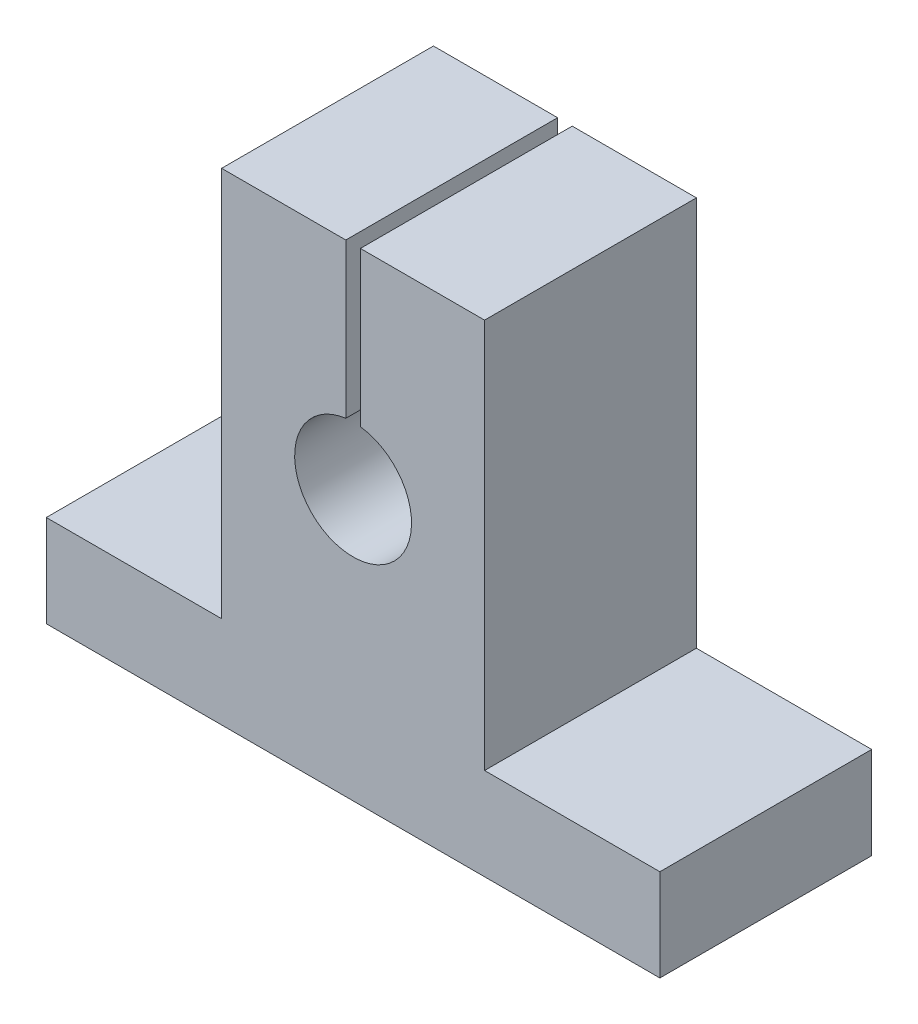
ISO-10303-21;
HEADER;
FILE_DESCRIPTION(('STEP AP214'),'2;1');
FILE_NAME('part.step','',(''),(''),'','','');
FILE_SCHEMA(('AUTOMOTIVE_DESIGN { 1 0 10303 214 1 1 1 1 }'));
ENDSEC;
DATA;
#1=APPLICATION_CONTEXT('core data for automotive mechanical design processes');
#2=APPLICATION_PROTOCOL_DEFINITION('international standard','automotive_design',2000,#1);
#3=PRODUCT_CONTEXT('',#1,'mechanical');
#4=PRODUCT('Part','Part','',(#3));
#5=PRODUCT_RELATED_PRODUCT_CATEGORY('part','',(#4));
#6=PRODUCT_DEFINITION_FORMATION('','',#4);
#7=PRODUCT_DEFINITION_CONTEXT('part definition',#1,'design');
#8=PRODUCT_DEFINITION('design','',#6,#7);
#9=PRODUCT_DEFINITION_SHAPE('','',#8);
#10=(LENGTH_UNIT() NAMED_UNIT(*) SI_UNIT(.MILLI.,.METRE.));
#11=(NAMED_UNIT(*) PLANE_ANGLE_UNIT() SI_UNIT($,.RADIAN.));
#12=(NAMED_UNIT(*) SI_UNIT($,.STERADIAN.) SOLID_ANGLE_UNIT());
#13=UNCERTAINTY_MEASURE_WITH_UNIT(LENGTH_MEASURE(1.E-05),#10,'distance_accuracy_value','');
#14=(GEOMETRIC_REPRESENTATION_CONTEXT(3) GLOBAL_UNCERTAINTY_ASSIGNED_CONTEXT((#13)) GLOBAL_UNIT_ASSIGNED_CONTEXT((#10,
#11,#12)) REPRESENTATION_CONTEXT('',''));
#15=CARTESIAN_POINT('',(0.,0.,0.));
#16=DIRECTION('',(0.,0.,1.));
#17=DIRECTION('',(1.,0.,0.));
#18=AXIS2_PLACEMENT_3D('',#15,#16,#17);
#19=CARTESIAN_POINT('',(21.,0.,14.5));
#20=DIRECTION('',(-1.,0.,0.));
#21=DIRECTION('',(0.,0.,1.));
#22=AXIS2_PLACEMENT_3D('',#19,#20,#21);
#23=PLANE('',#22);
#24=DIRECTION('',(0.,1.,0.));
#25=VECTOR('',#24,1.);
#26=CARTESIAN_POINT('',(21.,0.,0.));
#27=LINE('',#26,#25);
#28=CARTESIAN_POINT('',(21.,0.,0.));
#29=VERTEX_POINT('',#28);
#30=CARTESIAN_POINT('',(21.,6.30000000000001,0.));
#31=VERTEX_POINT('',#30);
#32=EDGE_CURVE('E153',#29,#31,#27,.T.);
#33=ORIENTED_EDGE('',*,*,#32,.T.);
#34=DIRECTION('',(0.,0.,-1.));
#35=VECTOR('',#34,1.);
#36=CARTESIAN_POINT('',(21.,6.30000000000001,14.5));
#37=LINE('',#36,#35);
#38=CARTESIAN_POINT('',(21.,6.30000000000001,14.5));
#39=VERTEX_POINT('',#38);
#40=EDGE_CURVE('E11',#39,#31,#37,.T.);
#41=ORIENTED_EDGE('',*,*,#40,.F.);
#42=DIRECTION('',(0.,1.,0.));
#43=VECTOR('',#42,1.);
#44=CARTESIAN_POINT('',(21.,0.,14.5));
#45=LINE('',#44,#43);
#46=CARTESIAN_POINT('',(21.,0.,14.5));
#47=VERTEX_POINT('',#46);
#48=EDGE_CURVE('E175',#47,#39,#45,.T.);
#49=ORIENTED_EDGE('',*,*,#48,.F.);
#50=DIRECTION('',(0.,0.,-1.));
#51=VECTOR('',#50,1.);
#52=CARTESIAN_POINT('',(21.,0.,14.5));
#53=LINE('',#52,#51);
#54=EDGE_CURVE('E149',#47,#29,#53,.T.);
#55=ORIENTED_EDGE('',*,*,#54,.T.);
#56=EDGE_LOOP('',(#33,#41,#49,#55));
#57=FACE_BOUND('',#56,.T.);
#58=ADVANCED_FACE('F33',(#57),#23,.F.);
#59=CARTESIAN_POINT('',(21.,6.30000000000001,14.5));
#60=DIRECTION('',(0.,-1.,0.));
#61=DIRECTION('',(1.,0.,0.));
#62=AXIS2_PLACEMENT_3D('',#59,#60,#61);
#63=PLANE('',#62);
#64=DIRECTION('',(-1.,0.,0.));
#65=VECTOR('',#64,1.);
#66=CARTESIAN_POINT('',(21.,6.30000000000001,0.));
#67=LINE('',#66,#65);
#68=CARTESIAN_POINT('',(9.,6.30000000000001,0.));
#69=VERTEX_POINT('',#68);
#70=EDGE_CURVE('E156',#31,#69,#67,.T.);
#71=ORIENTED_EDGE('',*,*,#70,.T.);
#72=DIRECTION('',(0.,0.,-1.));
#73=VECTOR('',#72,1.);
#74=CARTESIAN_POINT('',(9.,6.30000000000001,14.5));
#75=LINE('',#74,#73);
#76=CARTESIAN_POINT('',(9.,6.30000000000001,14.5));
#77=VERTEX_POINT('',#76);
#78=EDGE_CURVE('E41',#77,#69,#75,.T.);
#79=ORIENTED_EDGE('',*,*,#78,.F.);
#80=DIRECTION('',(-1.,0.,0.));
#81=VECTOR('',#80,1.);
#82=CARTESIAN_POINT('',(21.,6.30000000000001,14.5));
#83=LINE('',#82,#81);
#84=EDGE_CURVE('E104',#39,#77,#83,.T.);
#85=ORIENTED_EDGE('',*,*,#84,.F.);
#86=ORIENTED_EDGE('',*,*,#40,.T.);
#87=EDGE_LOOP('',(#71,#79,#85,#86));
#88=FACE_BOUND('',#87,.T.);
#89=ADVANCED_FACE('F253',(#88),#63,.F.);
#90=CARTESIAN_POINT('',(9.,6.30000000000001,14.5));
#91=DIRECTION('',(-1.,0.,0.));
#92=DIRECTION('',(0.,0.,1.));
#93=AXIS2_PLACEMENT_3D('',#90,#91,#92);
#94=PLANE('',#93);
#95=DIRECTION('',(0.,1.,0.));
#96=VECTOR('',#95,1.);
#97=CARTESIAN_POINT('',(9.,6.30000000000001,0.));
#98=LINE('',#97,#96);
#99=CARTESIAN_POINT('',(9.,33.,0.));
#100=VERTEX_POINT('',#99);
#101=EDGE_CURVE('E158',#69,#100,#98,.T.);
#102=ORIENTED_EDGE('',*,*,#101,.T.);
#103=DIRECTION('',(0.,0.,-1.));
#104=VECTOR('',#103,1.);
#105=CARTESIAN_POINT('',(9.,33.,14.5));
#106=LINE('',#105,#104);
#107=CARTESIAN_POINT('',(9.,33.,14.5));
#108=VERTEX_POINT('',#107);
#109=EDGE_CURVE('E194',#108,#100,#106,.T.);
#110=ORIENTED_EDGE('',*,*,#109,.F.);
#111=DIRECTION('',(0.,1.,0.));
#112=VECTOR('',#111,1.);
#113=CARTESIAN_POINT('',(9.,6.30000000000001,14.5));
#114=LINE('',#113,#112);
#115=EDGE_CURVE('E202',#77,#108,#114,.T.);
#116=ORIENTED_EDGE('',*,*,#115,.F.);
#117=ORIENTED_EDGE('',*,*,#78,.T.);
#118=EDGE_LOOP('',(#102,#110,#116,#117));
#119=FACE_BOUND('',#118,.T.);
#120=ADVANCED_FACE('F200',(#119),#94,.F.);
#121=CARTESIAN_POINT('',(9.,33.,14.5));
#122=DIRECTION('',(0.,-1.,0.));
#123=DIRECTION('',(0.,0.,-1.));
#124=AXIS2_PLACEMENT_3D('',#121,#122,#123);
#125=PLANE('',#124);
#126=DIRECTION('',(-1.,0.,0.));
#127=VECTOR('',#126,1.);
#128=CARTESIAN_POINT('',(9.,33.,0.));
#129=LINE('',#128,#127);
#130=CARTESIAN_POINT('',(0.499999999999998,33.,0.));
#131=VERTEX_POINT('',#130);
#132=EDGE_CURVE('E160',#100,#131,#129,.T.);
#133=ORIENTED_EDGE('',*,*,#132,.T.);
#134=DIRECTION('',(0.,0.,-1.));
#135=VECTOR('',#134,1.);
#136=CARTESIAN_POINT('',(0.499999999999998,33.,14.5));
#137=LINE('',#136,#135);
#138=CARTESIAN_POINT('',(0.499999999999998,33.,14.5));
#139=VERTEX_POINT('',#138);
#140=EDGE_CURVE('E191',#139,#131,#137,.T.);
#141=ORIENTED_EDGE('',*,*,#140,.F.);
#142=DIRECTION('',(-1.,0.,0.));
#143=VECTOR('',#142,1.);
#144=CARTESIAN_POINT('',(9.,33.,14.5));
#145=LINE('',#144,#143);
#146=EDGE_CURVE('E220',#108,#139,#145,.T.);
#147=ORIENTED_EDGE('',*,*,#146,.F.);
#148=ORIENTED_EDGE('',*,*,#109,.T.);
#149=EDGE_LOOP('',(#133,#141,#147,#148));
#150=FACE_BOUND('',#149,.T.);
#151=ADVANCED_FACE('F211',(#150),#125,.F.);
#152=CARTESIAN_POINT('',(0.499999999999998,33.,14.5));
#153=DIRECTION('',(1.,0.,0.));
#154=DIRECTION('',(0.,0.,-1.));
#155=AXIS2_PLACEMENT_3D('',#152,#153,#154);
#156=PLANE('',#155);
#157=DIRECTION('',(0.,-1.,0.));
#158=VECTOR('',#157,1.);
#159=CARTESIAN_POINT('',(0.499999999999998,33.,0.));
#160=LINE('',#159,#158);
#161=CARTESIAN_POINT('',(0.499999999999997,22.4296672228718,0.));
#162=VERTEX_POINT('',#161);
#163=EDGE_CURVE('E162',#131,#162,#160,.T.);
#164=ORIENTED_EDGE('',*,*,#163,.T.);
#165=DIRECTION('',(0.,0.,-1.));
#166=VECTOR('',#165,1.);
#167=CARTESIAN_POINT('',(0.499999999999997,22.4296672228718,14.5));
#168=LINE('',#167,#166);
#169=CARTESIAN_POINT('',(0.499999999999997,22.4296672228718,14.5));
#170=VERTEX_POINT('',#169);
#171=EDGE_CURVE('E188',#170,#162,#168,.T.);
#172=ORIENTED_EDGE('',*,*,#171,.F.);
#173=DIRECTION('',(0.,-1.,0.));
#174=VECTOR('',#173,1.);
#175=CARTESIAN_POINT('',(0.499999999999998,33.,14.5));
#176=LINE('',#175,#174);
#177=EDGE_CURVE('E217',#139,#170,#176,.T.);
#178=ORIENTED_EDGE('',*,*,#177,.F.);
#179=ORIENTED_EDGE('',*,*,#140,.T.);
#180=EDGE_LOOP('',(#164,#172,#178,#179));
#181=FACE_BOUND('',#180,.T.);
#182=ADVANCED_FACE('F215',(#181),#156,.F.);
#183=CARTESIAN_POINT('',(0.,18.4610402562749,14.5));
#184=DIRECTION('',(0.,0.,-1.));
#185=DIRECTION('',(-1.,0.,0.));
#186=AXIS2_PLACEMENT_3D('',#183,#184,#185);
#187=CYLINDRICAL_SURFACE('',#186,4.);
#188=CARTESIAN_POINT('',(0.,18.4610402562749,0.));
#189=DIRECTION('',(0.,0.,-1.));
#190=DIRECTION('',(1.,0.,0.));
#191=AXIS2_PLACEMENT_3D('',#188,#189,#190);
#192=CIRCLE('',#191,4.);
#193=CARTESIAN_POINT('',(-0.500000000000002,22.4296672228718,0.));
#194=VERTEX_POINT('',#193);
#195=EDGE_CURVE('E164',#162,#194,#192,.T.);
#196=ORIENTED_EDGE('',*,*,#195,.T.);
#197=DIRECTION('',(0.,0.,-1.));
#198=VECTOR('',#197,1.);
#199=CARTESIAN_POINT('',(-0.500000000000002,22.4296672228718,14.5));
#200=LINE('',#199,#198);
#201=CARTESIAN_POINT('',(-0.500000000000002,22.4296672228718,14.5));
#202=VERTEX_POINT('',#201);
#203=EDGE_CURVE('E185',#202,#194,#200,.T.);
#204=ORIENTED_EDGE('',*,*,#203,.F.);
#205=CARTESIAN_POINT('',(0.,18.4610402562749,14.5));
#206=DIRECTION('',(0.,0.,-1.));
#207=DIRECTION('',(1.,0.,0.));
#208=AXIS2_PLACEMENT_3D('',#205,#206,#207);
#209=CIRCLE('',#208,4.);
#210=EDGE_CURVE('E219',#170,#202,#209,.T.);
#211=ORIENTED_EDGE('',*,*,#210,.F.);
#212=ORIENTED_EDGE('',*,*,#171,.T.);
#213=EDGE_LOOP('',(#196,#204,#211,#212));
#214=FACE_BOUND('',#213,.T.);
#215=ADVANCED_FACE('F266',(#214),#187,.F.);
#216=CARTESIAN_POINT('',(-0.500000000000002,33.,14.5));
#217=DIRECTION('',(-1.,0.,0.));
#218=DIRECTION('',(0.,0.,1.));
#219=AXIS2_PLACEMENT_3D('',#216,#217,#218);
#220=PLANE('',#219);
#221=DIRECTION('',(0.,1.,0.));
#222=VECTOR('',#221,1.);
#223=CARTESIAN_POINT('',(-0.500000000000002,33.,0.));
#224=LINE('',#223,#222);
#225=CARTESIAN_POINT('',(-0.500000000000002,33.,0.));
#226=VERTEX_POINT('',#225);
#227=EDGE_CURVE('E166',#194,#226,#224,.T.);
#228=ORIENTED_EDGE('',*,*,#227,.T.);
#229=DIRECTION('',(0.,0.,-1.));
#230=VECTOR('',#229,1.);
#231=CARTESIAN_POINT('',(-0.500000000000002,33.,14.5));
#232=LINE('',#231,#230);
#233=CARTESIAN_POINT('',(-0.500000000000002,33.,14.5));
#234=VERTEX_POINT('',#233);
#235=EDGE_CURVE('E182',#234,#226,#232,.T.);
#236=ORIENTED_EDGE('',*,*,#235,.F.);
#237=DIRECTION('',(0.,1.,0.));
#238=VECTOR('',#237,1.);
#239=CARTESIAN_POINT('',(-0.500000000000002,33.,14.5));
#240=LINE('',#239,#238);
#241=EDGE_CURVE('E222',#202,#234,#240,.T.);
#242=ORIENTED_EDGE('',*,*,#241,.F.);
#243=ORIENTED_EDGE('',*,*,#203,.T.);
#244=EDGE_LOOP('',(#228,#236,#242,#243));
#245=FACE_BOUND('',#244,.T.);
#246=ADVANCED_FACE('F269',(#245),#220,.F.);
#247=CARTESIAN_POINT('',(-0.500000000000002,33.,14.5));
#248=DIRECTION('',(0.,-1.,0.));
#249=DIRECTION('',(0.,0.,-1.));
#250=AXIS2_PLACEMENT_3D('',#247,#248,#249);
#251=PLANE('',#250);
#252=DIRECTION('',(-1.,0.,0.));
#253=VECTOR('',#252,1.);
#254=CARTESIAN_POINT('',(-0.500000000000002,33.,0.));
#255=LINE('',#254,#253);
#256=CARTESIAN_POINT('',(-9.00000000000001,33.,0.));
#257=VERTEX_POINT('',#256);
#258=EDGE_CURVE('E168',#226,#257,#255,.T.);
#259=ORIENTED_EDGE('',*,*,#258,.T.);
#260=DIRECTION('',(0.,0.,-1.));
#261=VECTOR('',#260,1.);
#262=CARTESIAN_POINT('',(-9.00000000000001,33.,14.5));
#263=LINE('',#262,#261);
#264=CARTESIAN_POINT('',(-9.00000000000001,33.,14.5));
#265=VERTEX_POINT('',#264);
#266=EDGE_CURVE('E179',#265,#257,#263,.T.);
#267=ORIENTED_EDGE('',*,*,#266,.F.);
#268=DIRECTION('',(-1.,0.,0.));
#269=VECTOR('',#268,1.);
#270=CARTESIAN_POINT('',(-0.500000000000002,33.,14.5));
#271=LINE('',#270,#269);
#272=EDGE_CURVE('E228',#234,#265,#271,.T.);
#273=ORIENTED_EDGE('',*,*,#272,.F.);
#274=ORIENTED_EDGE('',*,*,#235,.T.);
#275=EDGE_LOOP('',(#259,#267,#273,#274));
#276=FACE_BOUND('',#275,.T.);
#277=ADVANCED_FACE('F234',(#276),#251,.F.);
#278=CARTESIAN_POINT('',(-9.00000000000001,33.,14.5));
#279=DIRECTION('',(1.,0.,0.));
#280=DIRECTION('',(0.,1.,0.));
#281=AXIS2_PLACEMENT_3D('',#278,#279,#280);
#282=PLANE('',#281);
#283=DIRECTION('',(0.,-1.,0.));
#284=VECTOR('',#283,1.);
#285=CARTESIAN_POINT('',(-9.00000000000001,33.,0.));
#286=LINE('',#285,#284);
#287=CARTESIAN_POINT('',(-9.,6.3,0.));
#288=VERTEX_POINT('',#287);
#289=EDGE_CURVE('E170',#257,#288,#286,.T.);
#290=ORIENTED_EDGE('',*,*,#289,.T.);
#291=DIRECTION('',(0.,0.,-1.));
#292=VECTOR('',#291,1.);
#293=CARTESIAN_POINT('',(-9.,6.3,14.5));
#294=LINE('',#293,#292);
#295=CARTESIAN_POINT('',(-9.,6.3,14.5));
#296=VERTEX_POINT('',#295);
#297=EDGE_CURVE('E144',#296,#288,#294,.T.);
#298=ORIENTED_EDGE('',*,*,#297,.F.);
#299=DIRECTION('',(0.,-1.,0.));
#300=VECTOR('',#299,1.);
#301=CARTESIAN_POINT('',(-9.00000000000001,33.,14.5));
#302=LINE('',#301,#300);
#303=EDGE_CURVE('E135',#265,#296,#302,.T.);
#304=ORIENTED_EDGE('',*,*,#303,.F.);
#305=ORIENTED_EDGE('',*,*,#266,.T.);
#306=EDGE_LOOP('',(#290,#298,#304,#305));
#307=FACE_BOUND('',#306,.T.);
#308=ADVANCED_FACE('F238',(#307),#282,.F.);
#309=CARTESIAN_POINT('',(-9.,6.3,14.5));
#310=DIRECTION('',(0.,-1.,0.));
#311=DIRECTION('',(1.,0.,0.));
#312=AXIS2_PLACEMENT_3D('',#309,#310,#311);
#313=PLANE('',#312);
#314=DIRECTION('',(-1.,0.,0.));
#315=VECTOR('',#314,1.);
#316=CARTESIAN_POINT('',(-9.,6.3,0.));
#317=LINE('',#316,#315);
#318=CARTESIAN_POINT('',(-21.,6.3,0.));
#319=VERTEX_POINT('',#318);
#320=EDGE_CURVE('E143',#288,#319,#317,.T.);
#321=ORIENTED_EDGE('',*,*,#320,.T.);
#322=DIRECTION('',(0.,0.,-1.));
#323=VECTOR('',#322,1.);
#324=CARTESIAN_POINT('',(-21.,6.3,14.5));
#325=LINE('',#324,#323);
#326=CARTESIAN_POINT('',(-21.,6.3,14.5));
#327=VERTEX_POINT('',#326);
#328=EDGE_CURVE('E140',#327,#319,#325,.T.);
#329=ORIENTED_EDGE('',*,*,#328,.F.);
#330=DIRECTION('',(-1.,0.,0.));
#331=VECTOR('',#330,1.);
#332=CARTESIAN_POINT('',(-9.,6.3,14.5));
#333=LINE('',#332,#331);
#334=EDGE_CURVE('E129',#296,#327,#333,.T.);
#335=ORIENTED_EDGE('',*,*,#334,.F.);
#336=ORIENTED_EDGE('',*,*,#297,.T.);
#337=EDGE_LOOP('',(#321,#329,#335,#336));
#338=FACE_BOUND('',#337,.T.);
#339=ADVANCED_FACE('F141',(#338),#313,.F.);
#340=CARTESIAN_POINT('',(-21.,6.3,14.5));
#341=DIRECTION('',(1.,0.,0.));
#342=DIRECTION('',(0.,0.,-1.));
#343=AXIS2_PLACEMENT_3D('',#340,#341,#342);
#344=PLANE('',#343);
#345=DIRECTION('',(0.,-1.,0.));
#346=VECTOR('',#345,1.);
#347=CARTESIAN_POINT('',(-21.,6.3,0.));
#348=LINE('',#347,#346);
#349=CARTESIAN_POINT('',(-21.,0.,0.));
#350=VERTEX_POINT('',#349);
#351=EDGE_CURVE('E90',#319,#350,#348,.T.);
#352=ORIENTED_EDGE('',*,*,#351,.T.);
#353=DIRECTION('',(0.,0.,-1.));
#354=VECTOR('',#353,1.);
#355=CARTESIAN_POINT('',(-21.,0.,14.5));
#356=LINE('',#355,#354);
#357=CARTESIAN_POINT('',(-21.,0.,14.5));
#358=VERTEX_POINT('',#357);
#359=EDGE_CURVE('E145',#358,#350,#356,.T.);
#360=ORIENTED_EDGE('',*,*,#359,.F.);
#361=DIRECTION('',(0.,-1.,0.));
#362=VECTOR('',#361,1.);
#363=CARTESIAN_POINT('',(-21.,6.3,14.5));
#364=LINE('',#363,#362);
#365=EDGE_CURVE('E133',#327,#358,#364,.T.);
#366=ORIENTED_EDGE('',*,*,#365,.F.);
#367=ORIENTED_EDGE('',*,*,#328,.T.);
#368=EDGE_LOOP('',(#352,#360,#366,#367));
#369=FACE_BOUND('',#368,.T.);
#370=ADVANCED_FACE('F147',(#369),#344,.F.);
#371=CARTESIAN_POINT('',(-21.,0.,14.5));
#372=DIRECTION('',(0.,1.,0.));
#373=DIRECTION('',(0.,0.,1.));
#374=AXIS2_PLACEMENT_3D('',#371,#372,#373);
#375=PLANE('',#374);
#376=DIRECTION('',(1.,0.,0.));
#377=VECTOR('',#376,1.);
#378=CARTESIAN_POINT('',(-21.,0.,0.));
#379=LINE('',#378,#377);
#380=EDGE_CURVE('E96',#350,#29,#379,.T.);
#381=ORIENTED_EDGE('',*,*,#380,.T.);
#382=ORIENTED_EDGE('',*,*,#54,.F.);
#383=DIRECTION('',(1.,0.,0.));
#384=VECTOR('',#383,1.);
#385=CARTESIAN_POINT('',(-21.,0.,14.5));
#386=LINE('',#385,#384);
#387=EDGE_CURVE('E49',#358,#47,#386,.T.);
#388=ORIENTED_EDGE('',*,*,#387,.F.);
#389=ORIENTED_EDGE('',*,*,#359,.T.);
#390=EDGE_LOOP('',(#381,#382,#388,#389));
#391=FACE_BOUND('',#390,.T.);
#392=ADVANCED_FACE('F242',(#391),#375,.F.);
#393=CARTESIAN_POINT('',(0.,18.4610402562749,14.5));
#394=DIRECTION('',(0.,0.,1.));
#395=DIRECTION('',(1.,0.,0.));
#396=AXIS2_PLACEMENT_3D('',#393,#394,#395);
#397=PLANE('',#396);
#398=ORIENTED_EDGE('',*,*,#48,.T.);
#399=ORIENTED_EDGE('',*,*,#84,.T.);
#400=ORIENTED_EDGE('',*,*,#115,.T.);
#401=ORIENTED_EDGE('',*,*,#146,.T.);
#402=ORIENTED_EDGE('',*,*,#177,.T.);
#403=ORIENTED_EDGE('',*,*,#210,.T.);
#404=ORIENTED_EDGE('',*,*,#241,.T.);
#405=ORIENTED_EDGE('',*,*,#272,.T.);
#406=ORIENTED_EDGE('',*,*,#303,.T.);
#407=ORIENTED_EDGE('',*,*,#334,.T.);
#408=ORIENTED_EDGE('',*,*,#365,.T.);
#409=ORIENTED_EDGE('',*,*,#387,.T.);
#410=EDGE_LOOP('',(#398,#399,#400,#401,#402,#403,#404,#405,#406,#407,#408,#409));
#411=FACE_BOUND('',#410,.T.);
#412=ADVANCED_FACE('F131',(#411),#397,.T.);
#413=CARTESIAN_POINT('',(0.,18.4610402562749,0.));
#414=DIRECTION('',(0.,0.,1.));
#415=DIRECTION('',(1.,0.,0.));
#416=AXIS2_PLACEMENT_3D('',#413,#414,#415);
#417=PLANE('',#416);
#418=ORIENTED_EDGE('',*,*,#32,.F.);
#419=ORIENTED_EDGE('',*,*,#380,.F.);
#420=ORIENTED_EDGE('',*,*,#351,.F.);
#421=ORIENTED_EDGE('',*,*,#320,.F.);
#422=ORIENTED_EDGE('',*,*,#289,.F.);
#423=ORIENTED_EDGE('',*,*,#258,.F.);
#424=ORIENTED_EDGE('',*,*,#227,.F.);
#425=ORIENTED_EDGE('',*,*,#195,.F.);
#426=ORIENTED_EDGE('',*,*,#163,.F.);
#427=ORIENTED_EDGE('',*,*,#132,.F.);
#428=ORIENTED_EDGE('',*,*,#101,.F.);
#429=ORIENTED_EDGE('',*,*,#70,.F.);
#430=EDGE_LOOP('',(#418,#419,#420,#421,#422,#423,#424,#425,#426,#427,#428,#429));
#431=FACE_BOUND('',#430,.T.);
#432=ADVANCED_FACE('F206',(#431),#417,.F.);
#433=CLOSED_SHELL('',(#58,#89,#120,#151,#182,#215,#246,#277,#308,#339,#370,#392,#412,#432));
#434=MANIFOLD_SOLID_BREP('B2',#433);
#435=ADVANCED_BREP_SHAPE_REPRESENTATION('',(#18,#434),#14);
#436=SHAPE_DEFINITION_REPRESENTATION(#9,#435);
ENDSEC;
END-ISO-10303-21;
